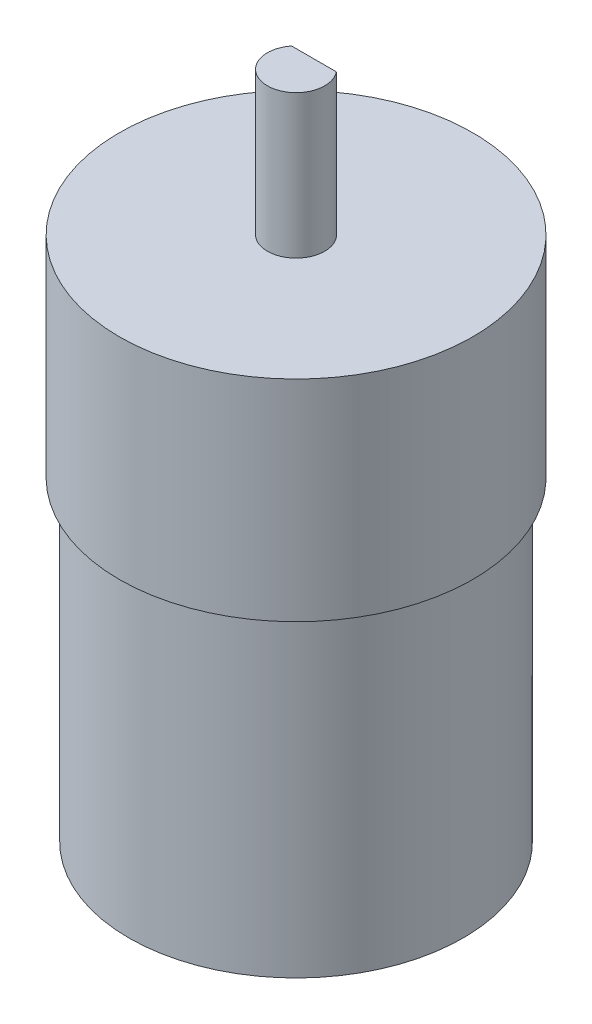
ISO-10303-21;
HEADER;
FILE_DESCRIPTION(('STEP AP214'),'2;1');
FILE_NAME('part.step','',(''),(''),'','','');
FILE_SCHEMA(('AUTOMOTIVE_DESIGN { 1 0 10303 214 1 1 1 1 }'));
ENDSEC;
DATA;
#1=APPLICATION_CONTEXT('core data for automotive mechanical design processes');
#2=APPLICATION_PROTOCOL_DEFINITION('international standard','automotive_design',2000,#1);
#3=PRODUCT_CONTEXT('',#1,'mechanical');
#4=PRODUCT('Part','Part','',(#3));
#5=PRODUCT_RELATED_PRODUCT_CATEGORY('part','',(#4));
#6=PRODUCT_DEFINITION_FORMATION('','',#4);
#7=PRODUCT_DEFINITION_CONTEXT('part definition',#1,'design');
#8=PRODUCT_DEFINITION('design','',#6,#7);
#9=PRODUCT_DEFINITION_SHAPE('','',#8);
#10=(LENGTH_UNIT() NAMED_UNIT(*) SI_UNIT(.MILLI.,.METRE.));
#11=(NAMED_UNIT(*) PLANE_ANGLE_UNIT() SI_UNIT($,.RADIAN.));
#12=(NAMED_UNIT(*) SI_UNIT($,.STERADIAN.) SOLID_ANGLE_UNIT());
#13=UNCERTAINTY_MEASURE_WITH_UNIT(LENGTH_MEASURE(1.E-05),#10,'distance_accuracy_value','');
#14=(GEOMETRIC_REPRESENTATION_CONTEXT(3) GLOBAL_UNCERTAINTY_ASSIGNED_CONTEXT((#13)) GLOBAL_UNIT_ASSIGNED_CONTEXT((#10,
#11,#12)) REPRESENTATION_CONTEXT('',''));
#15=CARTESIAN_POINT('',(0.,0.,0.));
#16=DIRECTION('',(0.,0.,1.));
#17=DIRECTION('',(1.,0.,0.));
#18=AXIS2_PLACEMENT_3D('',#15,#16,#17);
#19=CARTESIAN_POINT('',(0.,33.,0.));
#20=DIRECTION('',(0.,-1.,0.));
#21=DIRECTION('',(0.,0.,-1.));
#22=AXIS2_PLACEMENT_3D('',#19,#20,#21);
#23=CYLINDRICAL_SURFACE('',#22,17.5);
#24=CARTESIAN_POINT('',(0.,33.,0.));
#25=DIRECTION('',(0.,1.,0.));
#26=DIRECTION('',(0.,0.,1.));
#27=AXIS2_PLACEMENT_3D('',#24,#25,#26);
#28=CIRCLE('',#27,17.5);
#29=CARTESIAN_POINT('',(0.,33.,17.5));
#30=VERTEX_POINT('',#29);
#31=EDGE_CURVE('E11',#30,#30,#28,.T.);
#32=ORIENTED_EDGE('',*,*,#31,.F.);
#33=EDGE_LOOP('',(#32));
#34=FACE_BOUND('',#33,.T.);
#35=CARTESIAN_POINT('',(0.,0.,0.));
#36=DIRECTION('',(0.,1.,0.));
#37=DIRECTION('',(0.,0.,1.));
#38=AXIS2_PLACEMENT_3D('',#35,#36,#37);
#39=CIRCLE('',#38,17.5);
#40=CARTESIAN_POINT('',(0.,0.,17.5));
#41=VERTEX_POINT('',#40);
#42=EDGE_CURVE('E38',#41,#41,#39,.T.);
#43=ORIENTED_EDGE('',*,*,#42,.T.);
#44=EDGE_LOOP('',(#43));
#45=FACE_BOUND('',#44,.T.);
#46=ADVANCED_FACE('F35',(#34,#45),#23,.T.);
#47=CARTESIAN_POINT('',(0.,0.,0.));
#48=DIRECTION('',(0.,1.,0.));
#49=DIRECTION('',(0.,0.,1.));
#50=AXIS2_PLACEMENT_3D('',#47,#48,#49);
#51=PLANE('',#50);
#52=ORIENTED_EDGE('',*,*,#42,.F.);
#53=EDGE_LOOP('',(#52));
#54=FACE_BOUND('',#53,.T.);
#55=ADVANCED_FACE('F102',(#54),#51,.F.);
#56=CARTESIAN_POINT('',(0.,55.,0.));
#57=DIRECTION('',(0.,-1.,0.));
#58=DIRECTION('',(0.,0.,-1.));
#59=AXIS2_PLACEMENT_3D('',#56,#57,#58);
#60=CYLINDRICAL_SURFACE('',#59,18.5);
#61=CARTESIAN_POINT('',(0.,55.,0.));
#62=DIRECTION('',(0.,1.,0.));
#63=DIRECTION('',(0.,0.,1.));
#64=AXIS2_PLACEMENT_3D('',#61,#62,#63);
#65=CIRCLE('',#64,18.5);
#66=CARTESIAN_POINT('',(0.,55.,18.5));
#67=VERTEX_POINT('',#66);
#68=EDGE_CURVE('E82',#67,#67,#65,.T.);
#69=ORIENTED_EDGE('',*,*,#68,.F.);
#70=EDGE_LOOP('',(#69));
#71=FACE_BOUND('',#70,.T.);
#72=CARTESIAN_POINT('',(0.,33.,0.));
#73=DIRECTION('',(0.,1.,0.));
#74=DIRECTION('',(0.,0.,1.));
#75=AXIS2_PLACEMENT_3D('',#72,#73,#74);
#76=CIRCLE('',#75,18.5);
#77=CARTESIAN_POINT('',(0.,33.,18.5));
#78=VERTEX_POINT('',#77);
#79=EDGE_CURVE('E81',#78,#78,#76,.T.);
#80=ORIENTED_EDGE('',*,*,#79,.T.);
#81=EDGE_LOOP('',(#80));
#82=FACE_BOUND('',#81,.T.);
#83=ADVANCED_FACE('F88',(#71,#82),#60,.T.);
#84=CARTESIAN_POINT('',(0.,55.,0.));
#85=DIRECTION('',(0.,1.,0.));
#86=DIRECTION('',(0.,0.,1.));
#87=AXIS2_PLACEMENT_3D('',#84,#85,#86);
#88=PLANE('',#87);
#89=CARTESIAN_POINT('',(0.,55.,0.));
#90=DIRECTION('',(0.,1.,0.));
#91=DIRECTION('',(0.,0.,1.));
#92=AXIS2_PLACEMENT_3D('',#89,#90,#91);
#93=CIRCLE('',#92,3.);
#94=CARTESIAN_POINT('',(-2.33952361660854,55.,-1.87793217325091));
#95=VERTEX_POINT('',#94);
#96=CARTESIAN_POINT('',(2.33952361660854,55.,-1.87793217325091));
#97=VERTEX_POINT('',#96);
#98=EDGE_CURVE('E64',#95,#97,#93,.T.);
#99=ORIENTED_EDGE('',*,*,#98,.F.);
#100=DIRECTION('',(-1.,0.,0.));
#101=VECTOR('',#100,1.);
#102=CARTESIAN_POINT('',(0.,55.,-1.87793217325091));
#103=LINE('',#102,#101);
#104=EDGE_CURVE('E49',#97,#95,#103,.T.);
#105=ORIENTED_EDGE('',*,*,#104,.F.);
#106=EDGE_LOOP('',(#99,#105));
#107=FACE_BOUND('',#106,.T.);
#108=ORIENTED_EDGE('',*,*,#68,.T.);
#109=EDGE_LOOP('',(#108));
#110=FACE_BOUND('',#109,.T.);
#111=ADVANCED_FACE('F74',(#107,#110),#88,.T.);
#112=CARTESIAN_POINT('',(0.,33.,0.));
#113=DIRECTION('',(0.,1.,0.));
#114=DIRECTION('',(0.,0.,1.));
#115=AXIS2_PLACEMENT_3D('',#112,#113,#114);
#116=PLANE('',#115);
#117=ORIENTED_EDGE('',*,*,#31,.T.);
#118=EDGE_LOOP('',(#117));
#119=FACE_BOUND('',#118,.T.);
#120=ORIENTED_EDGE('',*,*,#79,.F.);
#121=EDGE_LOOP('',(#120));
#122=FACE_BOUND('',#121,.T.);
#123=ADVANCED_FACE('F90',(#119,#122),#116,.F.);
#124=CARTESIAN_POINT('',(0.,70.,-1.87793217325091));
#125=DIRECTION('',(0.,0.,1.));
#126=DIRECTION('',(1.,0.,0.));
#127=AXIS2_PLACEMENT_3D('',#124,#125,#126);
#128=PLANE('',#127);
#129=ORIENTED_EDGE('',*,*,#104,.T.);
#130=DIRECTION('',(0.,-1.,0.));
#131=VECTOR('',#130,1.);
#132=CARTESIAN_POINT('',(-2.33952361660854,70.,-1.87793217325091));
#133=LINE('',#132,#131);
#134=CARTESIAN_POINT('',(-2.33952361660854,70.,-1.87793217325091));
#135=VERTEX_POINT('',#134);
#136=EDGE_CURVE('E68',#135,#95,#133,.T.);
#137=ORIENTED_EDGE('',*,*,#136,.F.);
#138=DIRECTION('',(-1.,0.,0.));
#139=VECTOR('',#138,1.);
#140=CARTESIAN_POINT('',(0.,70.,-1.87793217325091));
#141=LINE('',#140,#139);
#142=CARTESIAN_POINT('',(2.33952361660854,70.,-1.87793217325091));
#143=VERTEX_POINT('',#142);
#144=EDGE_CURVE('E70',#143,#135,#141,.T.);
#145=ORIENTED_EDGE('',*,*,#144,.F.);
#146=DIRECTION('',(0.,-1.,0.));
#147=VECTOR('',#146,1.);
#148=CARTESIAN_POINT('',(2.33952361660854,70.,-1.87793217325091));
#149=LINE('',#148,#147);
#150=EDGE_CURVE('E66',#143,#97,#149,.T.);
#151=ORIENTED_EDGE('',*,*,#150,.T.);
#152=EDGE_LOOP('',(#129,#137,#145,#151));
#153=FACE_BOUND('',#152,.T.);
#154=ADVANCED_FACE('F72',(#153),#128,.F.);
#155=CARTESIAN_POINT('',(0.,70.,0.));
#156=DIRECTION('',(0.,-1.,0.));
#157=DIRECTION('',(0.,0.,-1.));
#158=AXIS2_PLACEMENT_3D('',#155,#156,#157);
#159=CYLINDRICAL_SURFACE('',#158,3.);
#160=ORIENTED_EDGE('',*,*,#98,.T.);
#161=ORIENTED_EDGE('',*,*,#150,.F.);
#162=CARTESIAN_POINT('',(0.,70.,0.));
#163=DIRECTION('',(0.,1.,0.));
#164=DIRECTION('',(0.,0.,1.));
#165=AXIS2_PLACEMENT_3D('',#162,#163,#164);
#166=CIRCLE('',#165,3.);
#167=EDGE_CURVE('E57',#135,#143,#166,.T.);
#168=ORIENTED_EDGE('',*,*,#167,.F.);
#169=ORIENTED_EDGE('',*,*,#136,.T.);
#170=EDGE_LOOP('',(#160,#161,#168,#169));
#171=FACE_BOUND('',#170,.T.);
#172=ADVANCED_FACE('F65',(#171),#159,.T.);
#173=CARTESIAN_POINT('',(0.,70.,0.));
#174=DIRECTION('',(0.,1.,0.));
#175=DIRECTION('',(0.,0.,1.));
#176=AXIS2_PLACEMENT_3D('',#173,#174,#175);
#177=PLANE('',#176);
#178=ORIENTED_EDGE('',*,*,#144,.T.);
#179=ORIENTED_EDGE('',*,*,#167,.T.);
#180=EDGE_LOOP('',(#178,#179));
#181=FACE_BOUND('',#180,.T.);
#182=ADVANCED_FACE('F141',(#181),#177,.T.);
#183=CLOSED_SHELL('',(#46,#55,#83,#111,#123,#154,#172,#182));
#184=MANIFOLD_SOLID_BREP('B2',#183);
#185=ADVANCED_BREP_SHAPE_REPRESENTATION('',(#18,#184),#14);
#186=SHAPE_DEFINITION_REPRESENTATION(#9,#185);
ENDSEC;
END-ISO-10303-21;
